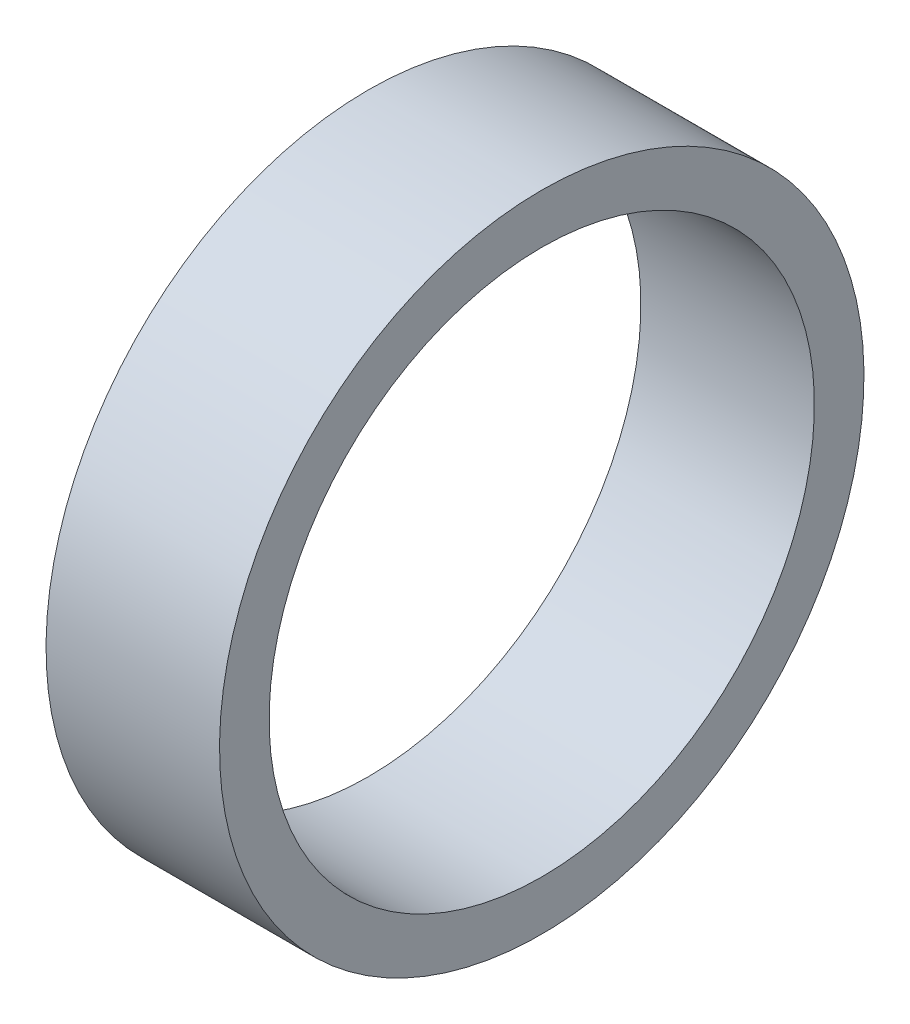
ISO-10303-21;
HEADER;
FILE_DESCRIPTION(('STEP AP214'),'2;1');
FILE_NAME('part.step','',(''),(''),'','','');
FILE_SCHEMA(('AUTOMOTIVE_DESIGN { 1 0 10303 214 1 1 1 1 }'));
ENDSEC;
DATA;
#1=APPLICATION_CONTEXT('core data for automotive mechanical design processes');
#2=APPLICATION_PROTOCOL_DEFINITION('international standard','automotive_design',2000,#1);
#3=PRODUCT_CONTEXT('',#1,'mechanical');
#4=PRODUCT('Part','Part','',(#3));
#5=PRODUCT_RELATED_PRODUCT_CATEGORY('part','',(#4));
#6=PRODUCT_DEFINITION_FORMATION('','',#4);
#7=PRODUCT_DEFINITION_CONTEXT('part definition',#1,'design');
#8=PRODUCT_DEFINITION('design','',#6,#7);
#9=PRODUCT_DEFINITION_SHAPE('','',#8);
#10=(LENGTH_UNIT() NAMED_UNIT(*) SI_UNIT(.MILLI.,.METRE.));
#11=(NAMED_UNIT(*) PLANE_ANGLE_UNIT() SI_UNIT($,.RADIAN.));
#12=(NAMED_UNIT(*) SI_UNIT($,.STERADIAN.) SOLID_ANGLE_UNIT());
#13=UNCERTAINTY_MEASURE_WITH_UNIT(LENGTH_MEASURE(1.E-05),#10,'distance_accuracy_value','');
#14=(GEOMETRIC_REPRESENTATION_CONTEXT(3) GLOBAL_UNCERTAINTY_ASSIGNED_CONTEXT((#13)) GLOBAL_UNIT_ASSIGNED_CONTEXT((#10,
#11,#12)) REPRESENTATION_CONTEXT('',''));
#15=CARTESIAN_POINT('',(0.,0.,0.));
#16=DIRECTION('',(0.,0.,1.));
#17=DIRECTION('',(1.,0.,0.));
#18=AXIS2_PLACEMENT_3D('',#15,#16,#17);
#19=CARTESIAN_POINT('',(0.,0.,0.));
#20=DIRECTION('',(1.,0.,0.));
#21=DIRECTION('',(0.,1.,0.));
#22=AXIS2_PLACEMENT_3D('',#19,#20,#21);
#23=CYLINDRICAL_SURFACE('',#22,11.);
#24=CARTESIAN_POINT('',(0.,0.,0.));
#25=DIRECTION('',(1.,0.,0.));
#26=DIRECTION('',(0.,1.,0.));
#27=AXIS2_PLACEMENT_3D('',#24,#25,#26);
#28=CIRCLE('',#27,11.);
#29=CARTESIAN_POINT('',(0.,11.,0.));
#30=VERTEX_POINT('',#29);
#31=EDGE_CURVE('E10',#30,#30,#28,.T.);
#32=ORIENTED_EDGE('',*,*,#31,.T.);
#33=EDGE_LOOP('',(#32));
#34=FACE_BOUND('',#33,.T.);
#35=CARTESIAN_POINT('',(-7.,0.,0.));
#36=DIRECTION('',(1.,0.,0.));
#37=DIRECTION('',(0.,1.,0.));
#38=AXIS2_PLACEMENT_3D('',#35,#36,#37);
#39=CIRCLE('',#38,11.);
#40=CARTESIAN_POINT('',(-7.,11.,0.));
#41=VERTEX_POINT('',#40);
#42=EDGE_CURVE('E58',#41,#41,#39,.T.);
#43=ORIENTED_EDGE('',*,*,#42,.F.);
#44=EDGE_LOOP('',(#43));
#45=FACE_BOUND('',#44,.T.);
#46=ADVANCED_FACE('F41',(#34,#45),#23,.F.);
#47=CARTESIAN_POINT('',(0.,11.,0.));
#48=DIRECTION('',(1.,0.,0.));
#49=DIRECTION('',(0.,1.,0.));
#50=AXIS2_PLACEMENT_3D('',#47,#48,#49);
#51=PLANE('',#50);
#52=CARTESIAN_POINT('',(0.,0.,0.));
#53=DIRECTION('',(1.,0.,0.));
#54=DIRECTION('',(0.,1.,0.));
#55=AXIS2_PLACEMENT_3D('',#52,#53,#54);
#56=CIRCLE('',#55,13.);
#57=CARTESIAN_POINT('',(0.,13.,0.));
#58=VERTEX_POINT('',#57);
#59=EDGE_CURVE('E48',#58,#58,#56,.T.);
#60=ORIENTED_EDGE('',*,*,#59,.T.);
#61=EDGE_LOOP('',(#60));
#62=FACE_BOUND('',#61,.T.);
#63=ORIENTED_EDGE('',*,*,#31,.F.);
#64=EDGE_LOOP('',(#63));
#65=FACE_BOUND('',#64,.T.);
#66=ADVANCED_FACE('F69',(#62,#65),#51,.T.);
#67=CARTESIAN_POINT('',(0.,0.,0.));
#68=DIRECTION('',(1.,0.,0.));
#69=DIRECTION('',(0.,1.,0.));
#70=AXIS2_PLACEMENT_3D('',#67,#68,#69);
#71=CYLINDRICAL_SURFACE('',#70,13.);
#72=CARTESIAN_POINT('',(-7.,0.,0.));
#73=DIRECTION('',(1.,0.,0.));
#74=DIRECTION('',(0.,1.,0.));
#75=AXIS2_PLACEMENT_3D('',#72,#73,#74);
#76=CIRCLE('',#75,13.);
#77=CARTESIAN_POINT('',(-7.,13.,0.));
#78=VERTEX_POINT('',#77);
#79=EDGE_CURVE('E53',#78,#78,#76,.T.);
#80=ORIENTED_EDGE('',*,*,#79,.T.);
#81=EDGE_LOOP('',(#80));
#82=FACE_BOUND('',#81,.T.);
#83=ORIENTED_EDGE('',*,*,#59,.F.);
#84=EDGE_LOOP('',(#83));
#85=FACE_BOUND('',#84,.T.);
#86=ADVANCED_FACE('F73',(#82,#85),#71,.T.);
#87=CARTESIAN_POINT('',(-7.,13.,0.));
#88=DIRECTION('',(-1.,0.,0.));
#89=DIRECTION('',(0.,-1.,0.));
#90=AXIS2_PLACEMENT_3D('',#87,#88,#89);
#91=PLANE('',#90);
#92=ORIENTED_EDGE('',*,*,#42,.T.);
#93=EDGE_LOOP('',(#92));
#94=FACE_BOUND('',#93,.T.);
#95=ORIENTED_EDGE('',*,*,#79,.F.);
#96=EDGE_LOOP('',(#95));
#97=FACE_BOUND('',#96,.T.);
#98=ADVANCED_FACE('F65',(#94,#97),#91,.T.);
#99=CLOSED_SHELL('',(#46,#66,#86,#98));
#100=MANIFOLD_SOLID_BREP('B2',#99);
#101=ADVANCED_BREP_SHAPE_REPRESENTATION('',(#18,#100),#14);
#102=SHAPE_DEFINITION_REPRESENTATION(#9,#101);
ENDSEC;
END-ISO-10303-21;
